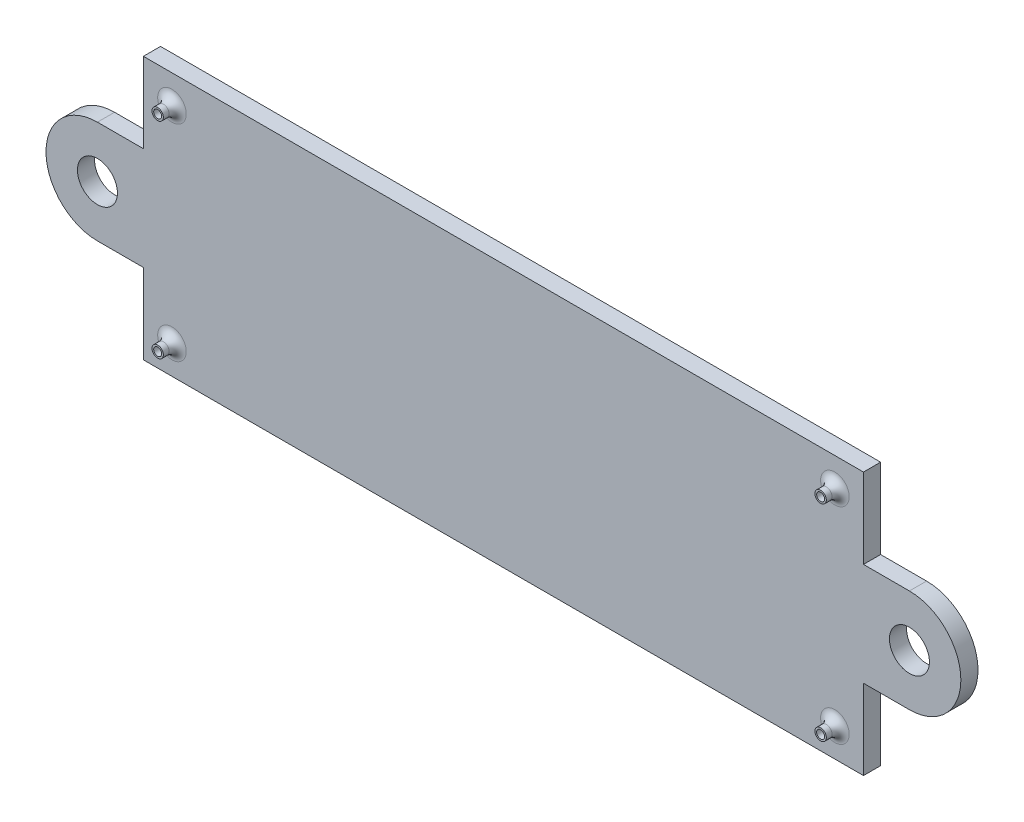
ISO-10303-21;
HEADER;
FILE_DESCRIPTION(('STEP AP214'),'2;1');
FILE_NAME('part.step','',(''),(''),'','','');
FILE_SCHEMA(('AUTOMOTIVE_DESIGN { 1 0 10303 214 1 1 1 1 }'));
ENDSEC;
DATA;
#1=APPLICATION_CONTEXT('core data for automotive mechanical design processes');
#2=APPLICATION_PROTOCOL_DEFINITION('international standard','automotive_design',2000,#1);
#3=PRODUCT_CONTEXT('',#1,'mechanical');
#4=PRODUCT('Part','Part','',(#3));
#5=PRODUCT_RELATED_PRODUCT_CATEGORY('part','',(#4));
#6=PRODUCT_DEFINITION_FORMATION('','',#4);
#7=PRODUCT_DEFINITION_CONTEXT('part definition',#1,'design');
#8=PRODUCT_DEFINITION('design','',#6,#7);
#9=PRODUCT_DEFINITION_SHAPE('','',#8);
#10=(LENGTH_UNIT() NAMED_UNIT(*) SI_UNIT(.MILLI.,.METRE.));
#11=(NAMED_UNIT(*) PLANE_ANGLE_UNIT() SI_UNIT($,.RADIAN.));
#12=(NAMED_UNIT(*) SI_UNIT($,.STERADIAN.) SOLID_ANGLE_UNIT());
#13=UNCERTAINTY_MEASURE_WITH_UNIT(LENGTH_MEASURE(1.E-05),#10,'distance_accuracy_value','');
#14=(GEOMETRIC_REPRESENTATION_CONTEXT(3) GLOBAL_UNCERTAINTY_ASSIGNED_CONTEXT((#13)) GLOBAL_UNIT_ASSIGNED_CONTEXT((#10,
#11,#12)) REPRESENTATION_CONTEXT('',''));
#15=CARTESIAN_POINT('',(0.,0.,0.));
#16=DIRECTION('',(0.,0.,1.));
#17=DIRECTION('',(1.,0.,0.));
#18=AXIS2_PLACEMENT_3D('',#15,#16,#17);
#19=CARTESIAN_POINT('',(-1.5,-1.50000000000002,-134.134261096858));
#20=DIRECTION('',(-1.,0.,0.));
#21=DIRECTION('',(0.,-1.,0.));
#22=AXIS2_PLACEMENT_3D('',#19,#20,#21);
#23=PLANE('',#22);
#24=DIRECTION('',(0.,-1.,0.));
#25=VECTOR('',#24,1.);
#26=CARTESIAN_POINT('',(-1.5,-1.50000000000002,3.));
#27=LINE('',#26,#25);
#28=CARTESIAN_POINT('',(-1.5,12.5,3.));
#29=VERTEX_POINT('',#28);
#30=CARTESIAN_POINT('',(-1.5,-1.50000000000002,3.));
#31=VERTEX_POINT('',#30);
#32=EDGE_CURVE('E226',#29,#31,#27,.T.);
#33=ORIENTED_EDGE('',*,*,#32,.F.);
#34=DIRECTION('',(0.,0.,-1.));
#35=VECTOR('',#34,1.);
#36=CARTESIAN_POINT('',(-1.5,12.5,27.7863367636564));
#37=LINE('',#36,#35);
#38=CARTESIAN_POINT('',(-1.5,12.5,0.));
#39=VERTEX_POINT('',#38);
#40=EDGE_CURVE('E139',#29,#39,#37,.T.);
#41=ORIENTED_EDGE('',*,*,#40,.T.);
#42=DIRECTION('',(0.,-1.,0.));
#43=VECTOR('',#42,1.);
#44=CARTESIAN_POINT('',(-1.5,-1.50000000000002,0.));
#45=LINE('',#44,#43);
#46=CARTESIAN_POINT('',(-1.5,-1.50000000000002,0.));
#47=VERTEX_POINT('',#46);
#48=EDGE_CURVE('E245',#39,#47,#45,.T.);
#49=ORIENTED_EDGE('',*,*,#48,.T.);
#50=DIRECTION('',(0.,0.,1.));
#51=VECTOR('',#50,1.);
#52=CARTESIAN_POINT('',(-1.5,-1.50000000000002,-134.134261096858));
#53=LINE('',#52,#51);
#54=EDGE_CURVE('E244',#47,#31,#53,.T.);
#55=ORIENTED_EDGE('',*,*,#54,.T.);
#56=EDGE_LOOP('',(#33,#41,#49,#55));
#57=FACE_BOUND('',#56,.T.);
#58=ADVANCED_FACE('F36',(#57),#23,.T.);
#59=CARTESIAN_POINT('',(124.5,44.5,-134.134261096858));
#60=DIRECTION('',(1.,0.,0.));
#61=DIRECTION('',(0.,1.,0.));
#62=AXIS2_PLACEMENT_3D('',#59,#60,#61);
#63=PLANE('',#62);
#64=DIRECTION('',(0.,1.,0.));
#65=VECTOR('',#64,1.);
#66=CARTESIAN_POINT('',(124.5,44.5,3.));
#67=LINE('',#66,#65);
#68=CARTESIAN_POINT('',(124.5,30.5,3.));
#69=VERTEX_POINT('',#68);
#70=CARTESIAN_POINT('',(124.5,44.5,3.));
#71=VERTEX_POINT('',#70);
#72=EDGE_CURVE('E59',#69,#71,#67,.T.);
#73=ORIENTED_EDGE('',*,*,#72,.F.);
#74=DIRECTION('',(0.,0.,-1.));
#75=VECTOR('',#74,1.);
#76=CARTESIAN_POINT('',(124.5,30.5,27.7863367636564));
#77=LINE('',#76,#75);
#78=CARTESIAN_POINT('',(124.5,30.5,0.));
#79=VERTEX_POINT('',#78);
#80=EDGE_CURVE('E183',#69,#79,#77,.T.);
#81=ORIENTED_EDGE('',*,*,#80,.T.);
#82=DIRECTION('',(0.,1.,0.));
#83=VECTOR('',#82,1.);
#84=CARTESIAN_POINT('',(124.5,44.5,0.));
#85=LINE('',#84,#83);
#86=CARTESIAN_POINT('',(124.5,44.5,0.));
#87=VERTEX_POINT('',#86);
#88=EDGE_CURVE('E237',#79,#87,#85,.T.);
#89=ORIENTED_EDGE('',*,*,#88,.T.);
#90=DIRECTION('',(0.,0.,1.));
#91=VECTOR('',#90,1.);
#92=CARTESIAN_POINT('',(124.5,44.5,-134.134261096858));
#93=LINE('',#92,#91);
#94=EDGE_CURVE('E234',#87,#71,#93,.T.);
#95=ORIENTED_EDGE('',*,*,#94,.T.);
#96=EDGE_LOOP('',(#73,#81,#89,#95));
#97=FACE_BOUND('',#96,.T.);
#98=ADVANCED_FACE('F300',(#97),#63,.T.);
#99=CARTESIAN_POINT('',(0.,0.,3.));
#100=DIRECTION('',(0.,0.,-1.));
#101=DIRECTION('',(-1.,0.,0.));
#102=AXIS2_PLACEMENT_3D('',#99,#100,#101);
#103=PLANE('',#102);
#104=CARTESIAN_POINT('',(119.5,3.5,3.));
#105=DIRECTION('',(0.,0.,-1.));
#106=DIRECTION('',(-1.,0.,0.));
#107=AXIS2_PLACEMENT_3D('',#104,#105,#106);
#108=CIRCLE('',#107,2.5);
#109=CARTESIAN_POINT('',(117.,3.5,3.));
#110=VERTEX_POINT('',#109);
#111=EDGE_CURVE('E11',#110,#110,#108,.T.);
#112=ORIENTED_EDGE('',*,*,#111,.T.);
#113=EDGE_LOOP('',(#112));
#114=FACE_BOUND('',#113,.T.);
#115=CARTESIAN_POINT('',(3.49999999999999,3.49999999999998,3.));
#116=DIRECTION('',(0.,0.,-1.));
#117=DIRECTION('',(-1.,0.,0.));
#118=AXIS2_PLACEMENT_3D('',#115,#116,#117);
#119=CIRCLE('',#118,2.5);
#120=CARTESIAN_POINT('',(0.999999999999993,3.49999999999998,3.));
#121=VERTEX_POINT('',#120);
#122=EDGE_CURVE('E272',#121,#121,#119,.T.);
#123=ORIENTED_EDGE('',*,*,#122,.T.);
#124=EDGE_LOOP('',(#123));
#125=FACE_BOUND('',#124,.T.);
#126=CARTESIAN_POINT('',(119.5,39.5,3.));
#127=DIRECTION('',(0.,0.,-1.));
#128=DIRECTION('',(-1.,0.,0.));
#129=AXIS2_PLACEMENT_3D('',#126,#127,#128);
#130=CIRCLE('',#129,2.5);
#131=CARTESIAN_POINT('',(117.,39.5,3.));
#132=VERTEX_POINT('',#131);
#133=EDGE_CURVE('E263',#132,#132,#130,.T.);
#134=ORIENTED_EDGE('',*,*,#133,.T.);
#135=EDGE_LOOP('',(#134));
#136=FACE_BOUND('',#135,.T.);
#137=CARTESIAN_POINT('',(3.49999999999999,39.5,3.));
#138=DIRECTION('',(0.,0.,-1.));
#139=DIRECTION('',(-1.,0.,0.));
#140=AXIS2_PLACEMENT_3D('',#137,#138,#139);
#141=CIRCLE('',#140,2.5);
#142=CARTESIAN_POINT('',(0.999999999999989,39.5,3.));
#143=VERTEX_POINT('',#142);
#144=EDGE_CURVE('E257',#143,#143,#141,.T.);
#145=ORIENTED_EDGE('',*,*,#144,.T.);
#146=EDGE_LOOP('',(#145));
#147=FACE_BOUND('',#146,.T.);
#148=DIRECTION('',(1.,0.,0.));
#149=VECTOR('',#148,1.);
#150=CARTESIAN_POINT('',(124.5,-1.5,3.));
#151=LINE('',#150,#149);
#152=CARTESIAN_POINT('',(124.5,-1.5,3.));
#153=VERTEX_POINT('',#152);
#154=EDGE_CURVE('E232',#31,#153,#151,.T.);
#155=ORIENTED_EDGE('',*,*,#154,.T.);
#156=CARTESIAN_POINT('',(124.5,12.5,3.));
#157=VERTEX_POINT('',#156);
#158=EDGE_CURVE('E229',#153,#157,#67,.T.);
#159=ORIENTED_EDGE('',*,*,#158,.T.);
#160=DIRECTION('',(1.,0.,0.));
#161=VECTOR('',#160,1.);
#162=CARTESIAN_POINT('',(124.5,12.5,3.));
#163=LINE('',#162,#161);
#164=CARTESIAN_POINT('',(132.540026119739,12.5,3.));
#165=VERTEX_POINT('',#164);
#166=EDGE_CURVE('E167',#157,#165,#163,.T.);
#167=ORIENTED_EDGE('',*,*,#166,.T.);
#168=CARTESIAN_POINT('',(132.540026119739,21.5,3.));
#169=DIRECTION('',(0.,0.,-1.));
#170=DIRECTION('',(-1.,0.,0.));
#171=AXIS2_PLACEMENT_3D('',#168,#169,#170);
#172=CIRCLE('',#171,9.);
#173=CARTESIAN_POINT('',(132.540026119739,30.5,3.));
#174=VERTEX_POINT('',#173);
#175=EDGE_CURVE('E168',#165,#174,#172,.F.);
#176=ORIENTED_EDGE('',*,*,#175,.T.);
#177=DIRECTION('',(-1.,0.,0.));
#178=VECTOR('',#177,1.);
#179=CARTESIAN_POINT('',(124.5,30.5,3.));
#180=LINE('',#179,#178);
#181=EDGE_CURVE('E164',#174,#69,#180,.T.);
#182=ORIENTED_EDGE('',*,*,#181,.T.);
#183=ORIENTED_EDGE('',*,*,#72,.T.);
#184=DIRECTION('',(-1.,0.,0.));
#185=VECTOR('',#184,1.);
#186=CARTESIAN_POINT('',(-1.50000000000001,44.5,3.));
#187=LINE('',#186,#185);
#188=CARTESIAN_POINT('',(-1.50000000000001,44.5,3.));
#189=VERTEX_POINT('',#188);
#190=EDGE_CURVE('E227',#71,#189,#187,.T.);
#191=ORIENTED_EDGE('',*,*,#190,.T.);
#192=CARTESIAN_POINT('',(-1.5,30.5,3.));
#193=VERTEX_POINT('',#192);
#194=EDGE_CURVE('E135',#189,#193,#27,.T.);
#195=ORIENTED_EDGE('',*,*,#194,.T.);
#196=DIRECTION('',(1.,0.,0.));
#197=VECTOR('',#196,1.);
#198=CARTESIAN_POINT('',(-1.5,30.5,3.));
#199=LINE('',#198,#197);
#200=CARTESIAN_POINT('',(-9.54002611973892,30.5,3.));
#201=VERTEX_POINT('',#200);
#202=EDGE_CURVE('E125',#201,#193,#199,.T.);
#203=ORIENTED_EDGE('',*,*,#202,.F.);
#204=CARTESIAN_POINT('',(-9.54002611973892,21.5,3.));
#205=DIRECTION('',(0.,0.,-1.));
#206=DIRECTION('',(-1.,0.,0.));
#207=AXIS2_PLACEMENT_3D('',#204,#205,#206);
#208=CIRCLE('',#207,9.);
#209=CARTESIAN_POINT('',(-9.54002611973892,12.5,3.));
#210=VERTEX_POINT('',#209);
#211=EDGE_CURVE('E131',#210,#201,#208,.T.);
#212=ORIENTED_EDGE('',*,*,#211,.F.);
#213=DIRECTION('',(-1.,0.,0.));
#214=VECTOR('',#213,1.);
#215=CARTESIAN_POINT('',(-1.5,12.5,3.));
#216=LINE('',#215,#214);
#217=EDGE_CURVE('E158',#29,#210,#216,.T.);
#218=ORIENTED_EDGE('',*,*,#217,.F.);
#219=ORIENTED_EDGE('',*,*,#32,.T.);
#220=EDGE_LOOP('',(#155,#159,#167,#176,#182,#183,#191,#195,#203,#212,#218,#219));
#221=FACE_BOUND('',#220,.T.);
#222=CARTESIAN_POINT('',(132.540026119739,21.5,3.));
#223=DIRECTION('',(0.,0.,-1.));
#224=DIRECTION('',(-1.,0.,0.));
#225=AXIS2_PLACEMENT_3D('',#222,#223,#224);
#226=CIRCLE('',#225,3.49999999999999);
#227=CARTESIAN_POINT('',(129.040026119739,21.5,3.));
#228=VERTEX_POINT('',#227);
#229=EDGE_CURVE('E166',#228,#228,#226,.F.);
#230=ORIENTED_EDGE('',*,*,#229,.F.);
#231=EDGE_LOOP('',(#230));
#232=FACE_BOUND('',#231,.T.);
#233=CARTESIAN_POINT('',(-9.54002611973892,21.5,3.));
#234=DIRECTION('',(0.,0.,-1.));
#235=DIRECTION('',(-1.,0.,0.));
#236=AXIS2_PLACEMENT_3D('',#233,#234,#235);
#237=CIRCLE('',#236,3.49999999999999);
#238=CARTESIAN_POINT('',(-13.0400261197389,21.5,3.));
#239=VERTEX_POINT('',#238);
#240=EDGE_CURVE('E160',#239,#239,#237,.T.);
#241=ORIENTED_EDGE('',*,*,#240,.T.);
#242=EDGE_LOOP('',(#241));
#243=FACE_BOUND('',#242,.T.);
#244=ADVANCED_FACE('F128',(#114,#125,#136,#147,#221,#232,#243),#103,.F.);
#245=CARTESIAN_POINT('',(124.5,-1.5,-134.134261096858));
#246=DIRECTION('',(0.,-1.,0.));
#247=DIRECTION('',(1.,0.,0.));
#248=AXIS2_PLACEMENT_3D('',#245,#246,#247);
#249=PLANE('',#248);
#250=ORIENTED_EDGE('',*,*,#54,.F.);
#251=DIRECTION('',(1.,0.,0.));
#252=VECTOR('',#251,1.);
#253=CARTESIAN_POINT('',(124.5,-1.5,0.));
#254=LINE('',#253,#252);
#255=CARTESIAN_POINT('',(124.5,-1.49999999999999,0.));
#256=VERTEX_POINT('',#255);
#257=EDGE_CURVE('E223',#47,#256,#254,.T.);
#258=ORIENTED_EDGE('',*,*,#257,.T.);
#259=DIRECTION('',(0.,0.,1.));
#260=VECTOR('',#259,1.);
#261=CARTESIAN_POINT('',(124.5,-1.5,-134.134261096858));
#262=LINE('',#261,#260);
#263=EDGE_CURVE('E240',#256,#153,#262,.T.);
#264=ORIENTED_EDGE('',*,*,#263,.T.);
#265=ORIENTED_EDGE('',*,*,#154,.F.);
#266=EDGE_LOOP('',(#250,#258,#264,#265));
#267=FACE_BOUND('',#266,.T.);
#268=ADVANCED_FACE('F314',(#267),#249,.T.);
#269=DIRECTION('',(0.,0.,-1.));
#270=VECTOR('',#269,1.);
#271=CARTESIAN_POINT('',(-1.5,30.5,27.7863367636564));
#272=LINE('',#271,#270);
#273=CARTESIAN_POINT('',(-1.5,30.5,0.));
#274=VERTEX_POINT('',#273);
#275=EDGE_CURVE('E138',#193,#274,#272,.T.);
#276=ORIENTED_EDGE('',*,*,#275,.F.);
#277=ORIENTED_EDGE('',*,*,#194,.F.);
#278=DIRECTION('',(0.,0.,1.));
#279=VECTOR('',#278,1.);
#280=CARTESIAN_POINT('',(-1.50000000000001,44.5,-134.134261096858));
#281=LINE('',#280,#279);
#282=CARTESIAN_POINT('',(-1.50000000000001,44.5,0.));
#283=VERTEX_POINT('',#282);
#284=EDGE_CURVE('E249',#283,#189,#281,.T.);
#285=ORIENTED_EDGE('',*,*,#284,.F.);
#286=EDGE_CURVE('E241',#283,#274,#45,.T.);
#287=ORIENTED_EDGE('',*,*,#286,.T.);
#288=EDGE_LOOP('',(#276,#277,#285,#287));
#289=FACE_BOUND('',#288,.T.);
#290=ADVANCED_FACE('F303',(#289),#23,.T.);
#291=CARTESIAN_POINT('',(-1.50000000000001,44.5,-134.134261096858));
#292=DIRECTION('',(0.,1.,0.));
#293=DIRECTION('',(0.,0.,1.));
#294=AXIS2_PLACEMENT_3D('',#291,#292,#293);
#295=PLANE('',#294);
#296=ORIENTED_EDGE('',*,*,#94,.F.);
#297=DIRECTION('',(-1.,0.,0.));
#298=VECTOR('',#297,1.);
#299=CARTESIAN_POINT('',(-1.50000000000001,44.5,0.));
#300=LINE('',#299,#298);
#301=EDGE_CURVE('E246',#87,#283,#300,.T.);
#302=ORIENTED_EDGE('',*,*,#301,.T.);
#303=ORIENTED_EDGE('',*,*,#284,.T.);
#304=ORIENTED_EDGE('',*,*,#190,.F.);
#305=EDGE_LOOP('',(#296,#302,#303,#304));
#306=FACE_BOUND('',#305,.T.);
#307=ADVANCED_FACE('F313',(#306),#295,.T.);
#308=DIRECTION('',(0.,0.,-1.));
#309=VECTOR('',#308,1.);
#310=CARTESIAN_POINT('',(124.5,12.5,27.7863367636564));
#311=LINE('',#310,#309);
#312=CARTESIAN_POINT('',(124.5,12.5,0.));
#313=VERTEX_POINT('',#312);
#314=EDGE_CURVE('E170',#157,#313,#311,.T.);
#315=ORIENTED_EDGE('',*,*,#314,.F.);
#316=ORIENTED_EDGE('',*,*,#158,.F.);
#317=ORIENTED_EDGE('',*,*,#263,.F.);
#318=EDGE_CURVE('E235',#256,#313,#85,.T.);
#319=ORIENTED_EDGE('',*,*,#318,.T.);
#320=EDGE_LOOP('',(#315,#316,#317,#319));
#321=FACE_BOUND('',#320,.T.);
#322=ADVANCED_FACE('F308',(#321),#63,.T.);
#323=CARTESIAN_POINT('',(0.,0.,0.));
#324=DIRECTION('',(0.,0.,-1.));
#325=DIRECTION('',(-1.,0.,0.));
#326=AXIS2_PLACEMENT_3D('',#323,#324,#325);
#327=PLANE('',#326);
#328=ORIENTED_EDGE('',*,*,#257,.F.);
#329=ORIENTED_EDGE('',*,*,#48,.F.);
#330=DIRECTION('',(1.,0.,0.));
#331=VECTOR('',#330,1.);
#332=CARTESIAN_POINT('',(-1.5,12.5,0.));
#333=LINE('',#332,#331);
#334=CARTESIAN_POINT('',(-9.54002611973892,12.5,0.));
#335=VERTEX_POINT('',#334);
#336=EDGE_CURVE('E51',#335,#39,#333,.T.);
#337=ORIENTED_EDGE('',*,*,#336,.F.);
#338=CARTESIAN_POINT('',(-9.54002611973892,21.5,0.));
#339=DIRECTION('',(0.,0.,1.));
#340=DIRECTION('',(-1.,0.,0.));
#341=AXIS2_PLACEMENT_3D('',#338,#339,#340);
#342=CIRCLE('',#341,9.);
#343=CARTESIAN_POINT('',(-9.54002611973892,30.5,0.));
#344=VERTEX_POINT('',#343);
#345=EDGE_CURVE('E149',#344,#335,#342,.T.);
#346=ORIENTED_EDGE('',*,*,#345,.F.);
#347=DIRECTION('',(-1.,0.,0.));
#348=VECTOR('',#347,1.);
#349=CARTESIAN_POINT('',(-1.5,30.5,0.));
#350=LINE('',#349,#348);
#351=EDGE_CURVE('E145',#274,#344,#350,.T.);
#352=ORIENTED_EDGE('',*,*,#351,.F.);
#353=ORIENTED_EDGE('',*,*,#286,.F.);
#354=ORIENTED_EDGE('',*,*,#301,.F.);
#355=ORIENTED_EDGE('',*,*,#88,.F.);
#356=DIRECTION('',(1.,0.,0.));
#357=VECTOR('',#356,1.);
#358=CARTESIAN_POINT('',(124.5,30.5,0.));
#359=LINE('',#358,#357);
#360=CARTESIAN_POINT('',(132.540026119739,30.5,0.));
#361=VERTEX_POINT('',#360);
#362=EDGE_CURVE('E174',#79,#361,#359,.T.);
#363=ORIENTED_EDGE('',*,*,#362,.T.);
#364=CARTESIAN_POINT('',(132.540026119739,21.5,0.));
#365=DIRECTION('',(0.,0.,-1.));
#366=DIRECTION('',(1.,0.,0.));
#367=AXIS2_PLACEMENT_3D('',#364,#365,#366);
#368=CIRCLE('',#367,9.);
#369=CARTESIAN_POINT('',(132.540026119739,12.5,0.));
#370=VERTEX_POINT('',#369);
#371=EDGE_CURVE('E177',#361,#370,#368,.T.);
#372=ORIENTED_EDGE('',*,*,#371,.T.);
#373=DIRECTION('',(-1.,0.,0.));
#374=VECTOR('',#373,1.);
#375=CARTESIAN_POINT('',(124.5,12.5,0.));
#376=LINE('',#375,#374);
#377=EDGE_CURVE('E180',#370,#313,#376,.T.);
#378=ORIENTED_EDGE('',*,*,#377,.T.);
#379=ORIENTED_EDGE('',*,*,#318,.F.);
#380=EDGE_LOOP('',(#328,#329,#337,#346,#352,#353,#354,#355,#363,#372,#378,#379));
#381=FACE_BOUND('',#380,.T.);
#382=CARTESIAN_POINT('',(132.540026119739,21.5,0.));
#383=DIRECTION('',(0.,0.,-1.));
#384=DIRECTION('',(-1.,0.,0.));
#385=AXIS2_PLACEMENT_3D('',#382,#383,#384);
#386=CIRCLE('',#385,3.49999999999999);
#387=CARTESIAN_POINT('',(129.040026119739,21.5,0.));
#388=VERTEX_POINT('',#387);
#389=EDGE_CURVE('E163',#388,#388,#386,.T.);
#390=ORIENTED_EDGE('',*,*,#389,.F.);
#391=EDGE_LOOP('',(#390));
#392=FACE_BOUND('',#391,.T.);
#393=CARTESIAN_POINT('',(-9.54002611973892,21.5,0.));
#394=DIRECTION('',(0.,0.,1.));
#395=DIRECTION('',(1.,0.,0.));
#396=AXIS2_PLACEMENT_3D('',#393,#394,#395);
#397=CIRCLE('',#396,3.49999999999999);
#398=CARTESIAN_POINT('',(-6.04002611973893,21.5,0.));
#399=VERTEX_POINT('',#398);
#400=EDGE_CURVE('E325',#399,#399,#397,.T.);
#401=ORIENTED_EDGE('',*,*,#400,.T.);
#402=EDGE_LOOP('',(#401));
#403=FACE_BOUND('',#402,.T.);
#404=ADVANCED_FACE('F332',(#381,#392,#403),#327,.T.);
#405=CARTESIAN_POINT('',(3.49999999999999,39.5,5.5));
#406=DIRECTION('',(0.,0.,1.));
#407=DIRECTION('',(1.,0.,0.));
#408=AXIS2_PLACEMENT_3D('',#405,#406,#407);
#409=PLANE('',#408);
#410=CARTESIAN_POINT('',(3.49999999999999,39.5,5.5));
#411=DIRECTION('',(0.,0.,1.));
#412=DIRECTION('',(1.,0.,0.));
#413=AXIS2_PLACEMENT_3D('',#410,#411,#412);
#414=CIRCLE('',#413,1.);
#415=CARTESIAN_POINT('',(4.49999999999999,39.5,5.5));
#416=VERTEX_POINT('',#415);
#417=EDGE_CURVE('E218',#416,#416,#414,.T.);
#418=ORIENTED_EDGE('',*,*,#417,.T.);
#419=EDGE_LOOP('',(#418));
#420=FACE_BOUND('',#419,.T.);
#421=CARTESIAN_POINT('',(3.49999999999999,39.5,5.5));
#422=DIRECTION('',(0.,0.,1.));
#423=DIRECTION('',(1.,0.,0.));
#424=AXIS2_PLACEMENT_3D('',#421,#422,#423);
#425=CIRCLE('',#424,0.69772156751062);
#426=CARTESIAN_POINT('',(4.19772156751061,39.5,5.5));
#427=VERTEX_POINT('',#426);
#428=EDGE_CURVE('E215',#427,#427,#425,.T.);
#429=ORIENTED_EDGE('',*,*,#428,.F.);
#430=EDGE_LOOP('',(#429));
#431=FACE_BOUND('',#430,.T.);
#432=ADVANCED_FACE('F401',(#420,#431),#409,.T.);
#433=CARTESIAN_POINT('',(3.49999999999999,39.5,5.5));
#434=DIRECTION('',(0.,0.,-1.));
#435=DIRECTION('',(-1.,0.,0.));
#436=AXIS2_PLACEMENT_3D('',#433,#434,#435);
#437=CYLINDRICAL_SURFACE('',#436,1.);
#438=CARTESIAN_POINT('',(3.49999999999999,39.5,4.5));
#439=DIRECTION('',(0.,0.,-1.));
#440=DIRECTION('',(-1.,0.,0.));
#441=AXIS2_PLACEMENT_3D('',#438,#439,#440);
#442=CIRCLE('',#441,1.);
#443=CARTESIAN_POINT('',(2.49999999999999,39.5,4.5));
#444=VERTEX_POINT('',#443);
#445=EDGE_CURVE('E225',#444,#444,#442,.F.);
#446=ORIENTED_EDGE('',*,*,#445,.T.);
#447=EDGE_LOOP('',(#446));
#448=FACE_BOUND('',#447,.T.);
#449=ORIENTED_EDGE('',*,*,#417,.F.);
#450=EDGE_LOOP('',(#449));
#451=FACE_BOUND('',#450,.T.);
#452=ADVANCED_FACE('F399',(#448,#451),#437,.T.);
#453=CARTESIAN_POINT('',(3.49999999999999,39.5,5.5));
#454=DIRECTION('',(0.,0.,-1.));
#455=DIRECTION('',(-1.,0.,0.));
#456=AXIS2_PLACEMENT_3D('',#453,#454,#455);
#457=CYLINDRICAL_SURFACE('',#456,0.69772156751062);
#458=ORIENTED_EDGE('',*,*,#428,.T.);
#459=EDGE_LOOP('',(#458));
#460=FACE_BOUND('',#459,.T.);
#461=CARTESIAN_POINT('',(3.49999999999999,39.5,3.));
#462=DIRECTION('',(0.,0.,1.));
#463=DIRECTION('',(1.,0.,0.));
#464=AXIS2_PLACEMENT_3D('',#461,#462,#463);
#465=CIRCLE('',#464,0.69772156751062);
#466=CARTESIAN_POINT('',(4.19772156751061,39.5,3.));
#467=VERTEX_POINT('',#466);
#468=EDGE_CURVE('E214',#467,#467,#465,.T.);
#469=ORIENTED_EDGE('',*,*,#468,.F.);
#470=EDGE_LOOP('',(#469));
#471=FACE_BOUND('',#470,.T.);
#472=ADVANCED_FACE('F395',(#460,#471),#457,.F.);
#473=ORIENTED_EDGE('',*,*,#468,.T.);
#474=EDGE_LOOP('',(#473));
#475=FACE_BOUND('',#474,.T.);
#476=ADVANCED_FACE('F398',(#475),#103,.F.);
#477=CARTESIAN_POINT('',(3.49999999999999,39.5,4.5));
#478=DIRECTION('',(0.,0.,-1.));
#479=DIRECTION('',(-1.,0.,0.));
#480=AXIS2_PLACEMENT_3D('',#477,#478,#479);
#481=TOROIDAL_SURFACE('',#480,2.5,1.5);
#482=ORIENTED_EDGE('',*,*,#144,.F.);
#483=EDGE_LOOP('',(#482));
#484=FACE_BOUND('',#483,.T.);
#485=ORIENTED_EDGE('',*,*,#445,.F.);
#486=EDGE_LOOP('',(#485));
#487=FACE_BOUND('',#486,.T.);
#488=ADVANCED_FACE('F393',(#484,#487),#481,.F.);
#489=CARTESIAN_POINT('',(119.5,39.5,5.5));
#490=DIRECTION('',(0.,0.,-1.));
#491=DIRECTION('',(-1.,0.,0.));
#492=AXIS2_PLACEMENT_3D('',#489,#490,#491);
#493=CYLINDRICAL_SURFACE('',#492,1.);
#494=CARTESIAN_POINT('',(119.5,39.5,4.5));
#495=DIRECTION('',(0.,0.,-1.));
#496=DIRECTION('',(-1.,0.,0.));
#497=AXIS2_PLACEMENT_3D('',#494,#495,#496);
#498=CIRCLE('',#497,1.);
#499=CARTESIAN_POINT('',(118.5,39.5,4.5));
#500=VERTEX_POINT('',#499);
#501=EDGE_CURVE('E266',#500,#500,#498,.F.);
#502=ORIENTED_EDGE('',*,*,#501,.T.);
#503=EDGE_LOOP('',(#502));
#504=FACE_BOUND('',#503,.T.);
#505=CARTESIAN_POINT('',(119.5,39.5,5.5));
#506=DIRECTION('',(0.,0.,-1.));
#507=DIRECTION('',(-1.,0.,0.));
#508=AXIS2_PLACEMENT_3D('',#505,#506,#507);
#509=CIRCLE('',#508,1.);
#510=CARTESIAN_POINT('',(118.5,39.5,5.5));
#511=VERTEX_POINT('',#510);
#512=EDGE_CURVE('E211',#511,#511,#509,.T.);
#513=ORIENTED_EDGE('',*,*,#512,.T.);
#514=EDGE_LOOP('',(#513));
#515=FACE_BOUND('',#514,.T.);
#516=ADVANCED_FACE('F389',(#504,#515),#493,.T.);
#517=CARTESIAN_POINT('',(119.5,39.5,5.5));
#518=DIRECTION('',(0.,0.,1.));
#519=DIRECTION('',(-1.,0.,0.));
#520=AXIS2_PLACEMENT_3D('',#517,#518,#519);
#521=PLANE('',#520);
#522=CARTESIAN_POINT('',(119.5,39.5,5.5));
#523=DIRECTION('',(0.,0.,-1.));
#524=DIRECTION('',(-1.,0.,0.));
#525=AXIS2_PLACEMENT_3D('',#522,#523,#524);
#526=CIRCLE('',#525,0.69772156751062);
#527=CARTESIAN_POINT('',(118.802278432489,39.5,5.5));
#528=VERTEX_POINT('',#527);
#529=EDGE_CURVE('E208',#528,#528,#526,.T.);
#530=ORIENTED_EDGE('',*,*,#529,.T.);
#531=EDGE_LOOP('',(#530));
#532=FACE_BOUND('',#531,.T.);
#533=ORIENTED_EDGE('',*,*,#512,.F.);
#534=EDGE_LOOP('',(#533));
#535=FACE_BOUND('',#534,.T.);
#536=ADVANCED_FACE('F385',(#532,#535),#521,.T.);
#537=CARTESIAN_POINT('',(119.5,39.5,5.5));
#538=DIRECTION('',(0.,0.,-1.));
#539=DIRECTION('',(-1.,0.,0.));
#540=AXIS2_PLACEMENT_3D('',#537,#538,#539);
#541=CYLINDRICAL_SURFACE('',#540,0.69772156751062);
#542=ORIENTED_EDGE('',*,*,#529,.F.);
#543=EDGE_LOOP('',(#542));
#544=FACE_BOUND('',#543,.T.);
#545=CARTESIAN_POINT('',(119.5,39.5,3.));
#546=DIRECTION('',(0.,0.,-1.));
#547=DIRECTION('',(-1.,0.,0.));
#548=AXIS2_PLACEMENT_3D('',#545,#546,#547);
#549=CIRCLE('',#548,0.69772156751062);
#550=CARTESIAN_POINT('',(118.802278432489,39.5,3.));
#551=VERTEX_POINT('',#550);
#552=EDGE_CURVE('E260',#551,#551,#549,.T.);
#553=ORIENTED_EDGE('',*,*,#552,.T.);
#554=EDGE_LOOP('',(#553));
#555=FACE_BOUND('',#554,.T.);
#556=ADVANCED_FACE('F381',(#544,#555),#541,.F.);
#557=ORIENTED_EDGE('',*,*,#552,.F.);
#558=EDGE_LOOP('',(#557));
#559=FACE_BOUND('',#558,.T.);
#560=ADVANCED_FACE('F384',(#559),#103,.F.);
#561=CARTESIAN_POINT('',(119.5,39.5,4.5));
#562=DIRECTION('',(0.,0.,-1.));
#563=DIRECTION('',(-1.,0.,0.));
#564=AXIS2_PLACEMENT_3D('',#561,#562,#563);
#565=TOROIDAL_SURFACE('',#564,2.5,1.5);
#566=ORIENTED_EDGE('',*,*,#501,.F.);
#567=EDGE_LOOP('',(#566));
#568=FACE_BOUND('',#567,.T.);
#569=ORIENTED_EDGE('',*,*,#133,.F.);
#570=EDGE_LOOP('',(#569));
#571=FACE_BOUND('',#570,.T.);
#572=ADVANCED_FACE('F379',(#568,#571),#565,.F.);
#573=CARTESIAN_POINT('',(3.49999999999999,3.49999999999998,5.5));
#574=DIRECTION('',(0.,0.,-1.));
#575=DIRECTION('',(-1.,0.,0.));
#576=AXIS2_PLACEMENT_3D('',#573,#574,#575);
#577=CYLINDRICAL_SURFACE('',#576,1.);
#578=CARTESIAN_POINT('',(3.49999999999999,3.49999999999998,4.5));
#579=DIRECTION('',(0.,0.,-1.));
#580=DIRECTION('',(-1.,0.,0.));
#581=AXIS2_PLACEMENT_3D('',#578,#579,#580);
#582=CIRCLE('',#581,1.);
#583=CARTESIAN_POINT('',(2.49999999999999,3.49999999999998,4.5));
#584=VERTEX_POINT('',#583);
#585=EDGE_CURVE('E275',#584,#584,#582,.F.);
#586=ORIENTED_EDGE('',*,*,#585,.T.);
#587=EDGE_LOOP('',(#586));
#588=FACE_BOUND('',#587,.T.);
#589=CARTESIAN_POINT('',(3.49999999999999,3.49999999999998,5.5));
#590=DIRECTION('',(0.,0.,-1.));
#591=DIRECTION('',(1.,0.,0.));
#592=AXIS2_PLACEMENT_3D('',#589,#590,#591);
#593=CIRCLE('',#592,1.);
#594=CARTESIAN_POINT('',(4.49999999999999,3.49999999999998,5.5));
#595=VERTEX_POINT('',#594);
#596=EDGE_CURVE('E205',#595,#595,#593,.T.);
#597=ORIENTED_EDGE('',*,*,#596,.T.);
#598=EDGE_LOOP('',(#597));
#599=FACE_BOUND('',#598,.T.);
#600=ADVANCED_FACE('F375',(#588,#599),#577,.T.);
#601=CARTESIAN_POINT('',(3.49999999999999,3.49999999999998,5.5));
#602=DIRECTION('',(0.,0.,1.));
#603=DIRECTION('',(1.,0.,0.));
#604=AXIS2_PLACEMENT_3D('',#601,#602,#603);
#605=PLANE('',#604);
#606=CARTESIAN_POINT('',(3.49999999999999,3.49999999999998,5.5));
#607=DIRECTION('',(0.,0.,-1.));
#608=DIRECTION('',(1.,0.,0.));
#609=AXIS2_PLACEMENT_3D('',#606,#607,#608);
#610=CIRCLE('',#609,0.69772156751062);
#611=CARTESIAN_POINT('',(4.19772156751061,3.49999999999998,5.5));
#612=VERTEX_POINT('',#611);
#613=EDGE_CURVE('E202',#612,#612,#610,.T.);
#614=ORIENTED_EDGE('',*,*,#613,.T.);
#615=EDGE_LOOP('',(#614));
#616=FACE_BOUND('',#615,.T.);
#617=ORIENTED_EDGE('',*,*,#596,.F.);
#618=EDGE_LOOP('',(#617));
#619=FACE_BOUND('',#618,.T.);
#620=ADVANCED_FACE('F371',(#616,#619),#605,.T.);
#621=CARTESIAN_POINT('',(3.49999999999999,3.49999999999998,5.5));
#622=DIRECTION('',(0.,0.,-1.));
#623=DIRECTION('',(-1.,0.,0.));
#624=AXIS2_PLACEMENT_3D('',#621,#622,#623);
#625=CYLINDRICAL_SURFACE('',#624,0.69772156751062);
#626=ORIENTED_EDGE('',*,*,#613,.F.);
#627=EDGE_LOOP('',(#626));
#628=FACE_BOUND('',#627,.T.);
#629=CARTESIAN_POINT('',(3.49999999999999,3.49999999999998,3.));
#630=DIRECTION('',(0.,0.,-1.));
#631=DIRECTION('',(-1.,0.,0.));
#632=AXIS2_PLACEMENT_3D('',#629,#630,#631);
#633=CIRCLE('',#632,0.69772156751062);
#634=CARTESIAN_POINT('',(2.80227843248937,3.49999999999998,3.));
#635=VERTEX_POINT('',#634);
#636=EDGE_CURVE('E269',#635,#635,#633,.T.);
#637=ORIENTED_EDGE('',*,*,#636,.T.);
#638=EDGE_LOOP('',(#637));
#639=FACE_BOUND('',#638,.T.);
#640=ADVANCED_FACE('F368',(#628,#639),#625,.F.);
#641=ORIENTED_EDGE('',*,*,#636,.F.);
#642=EDGE_LOOP('',(#641));
#643=FACE_BOUND('',#642,.T.);
#644=ADVANCED_FACE('F297',(#643),#103,.F.);
#645=CARTESIAN_POINT('',(3.49999999999999,3.49999999999998,4.5));
#646=DIRECTION('',(0.,0.,-1.));
#647=DIRECTION('',(-1.,0.,0.));
#648=AXIS2_PLACEMENT_3D('',#645,#646,#647);
#649=TOROIDAL_SURFACE('',#648,2.5,1.5);
#650=ORIENTED_EDGE('',*,*,#585,.F.);
#651=EDGE_LOOP('',(#650));
#652=FACE_BOUND('',#651,.T.);
#653=ORIENTED_EDGE('',*,*,#122,.F.);
#654=EDGE_LOOP('',(#653));
#655=FACE_BOUND('',#654,.T.);
#656=ADVANCED_FACE('F364',(#652,#655),#649,.F.);
#657=CARTESIAN_POINT('',(119.5,3.5,5.5));
#658=DIRECTION('',(0.,0.,1.));
#659=DIRECTION('',(-1.,0.,0.));
#660=AXIS2_PLACEMENT_3D('',#657,#658,#659);
#661=PLANE('',#660);
#662=CARTESIAN_POINT('',(119.5,3.5,5.5));
#663=DIRECTION('',(0.,0.,1.));
#664=DIRECTION('',(-1.,0.,0.));
#665=AXIS2_PLACEMENT_3D('',#662,#663,#664);
#666=CIRCLE('',#665,1.);
#667=CARTESIAN_POINT('',(118.5,3.5,5.5));
#668=VERTEX_POINT('',#667);
#669=EDGE_CURVE('E197',#668,#668,#666,.T.);
#670=ORIENTED_EDGE('',*,*,#669,.T.);
#671=EDGE_LOOP('',(#670));
#672=FACE_BOUND('',#671,.T.);
#673=CARTESIAN_POINT('',(119.5,3.5,5.5));
#674=DIRECTION('',(0.,0.,1.));
#675=DIRECTION('',(-1.,0.,0.));
#676=AXIS2_PLACEMENT_3D('',#673,#674,#675);
#677=CIRCLE('',#676,0.69772156751062);
#678=CARTESIAN_POINT('',(118.802278432489,3.5,5.5));
#679=VERTEX_POINT('',#678);
#680=EDGE_CURVE('E194',#679,#679,#677,.T.);
#681=ORIENTED_EDGE('',*,*,#680,.F.);
#682=EDGE_LOOP('',(#681));
#683=FACE_BOUND('',#682,.T.);
#684=ADVANCED_FACE('F361',(#672,#683),#661,.T.);
#685=CARTESIAN_POINT('',(119.5,3.5,5.5));
#686=DIRECTION('',(0.,0.,-1.));
#687=DIRECTION('',(-1.,0.,0.));
#688=AXIS2_PLACEMENT_3D('',#685,#686,#687);
#689=CYLINDRICAL_SURFACE('',#688,1.);
#690=CARTESIAN_POINT('',(119.5,3.5,4.5));
#691=DIRECTION('',(0.,0.,-1.));
#692=DIRECTION('',(-1.,0.,0.));
#693=AXIS2_PLACEMENT_3D('',#690,#691,#692);
#694=CIRCLE('',#693,1.);
#695=CARTESIAN_POINT('',(118.5,3.5,4.5));
#696=VERTEX_POINT('',#695);
#697=EDGE_CURVE('E44',#696,#696,#694,.F.);
#698=ORIENTED_EDGE('',*,*,#697,.T.);
#699=EDGE_LOOP('',(#698));
#700=FACE_BOUND('',#699,.T.);
#701=ORIENTED_EDGE('',*,*,#669,.F.);
#702=EDGE_LOOP('',(#701));
#703=FACE_BOUND('',#702,.T.);
#704=ADVANCED_FACE('F280',(#700,#703),#689,.T.);
#705=CARTESIAN_POINT('',(119.5,3.5,5.5));
#706=DIRECTION('',(0.,0.,-1.));
#707=DIRECTION('',(-1.,0.,0.));
#708=AXIS2_PLACEMENT_3D('',#705,#706,#707);
#709=CYLINDRICAL_SURFACE('',#708,0.69772156751062);
#710=ORIENTED_EDGE('',*,*,#680,.T.);
#711=EDGE_LOOP('',(#710));
#712=FACE_BOUND('',#711,.T.);
#713=CARTESIAN_POINT('',(119.5,3.5,3.));
#714=DIRECTION('',(0.,0.,1.));
#715=DIRECTION('',(-1.,0.,0.));
#716=AXIS2_PLACEMENT_3D('',#713,#714,#715);
#717=CIRCLE('',#716,0.69772156751062);
#718=CARTESIAN_POINT('',(118.802278432489,3.5,3.));
#719=VERTEX_POINT('',#718);
#720=EDGE_CURVE('E193',#719,#719,#717,.T.);
#721=ORIENTED_EDGE('',*,*,#720,.F.);
#722=EDGE_LOOP('',(#721));
#723=FACE_BOUND('',#722,.T.);
#724=ADVANCED_FACE('F294',(#712,#723),#709,.F.);
#725=ORIENTED_EDGE('',*,*,#720,.T.);
#726=EDGE_LOOP('',(#725));
#727=FACE_BOUND('',#726,.T.);
#728=ADVANCED_FACE('F285',(#727),#103,.F.);
#729=CARTESIAN_POINT('',(119.5,3.5,4.5));
#730=DIRECTION('',(0.,0.,-1.));
#731=DIRECTION('',(-1.,0.,0.));
#732=AXIS2_PLACEMENT_3D('',#729,#730,#731);
#733=TOROIDAL_SURFACE('',#732,2.5,1.5);
#734=ORIENTED_EDGE('',*,*,#111,.F.);
#735=EDGE_LOOP('',(#734));
#736=FACE_BOUND('',#735,.T.);
#737=ORIENTED_EDGE('',*,*,#697,.F.);
#738=EDGE_LOOP('',(#737));
#739=FACE_BOUND('',#738,.T.);
#740=ADVANCED_FACE('F38',(#736,#739),#733,.F.);
#741=CARTESIAN_POINT('',(124.5,30.5,27.7863367636564));
#742=DIRECTION('',(0.,1.,0.));
#743=DIRECTION('',(0.,0.,1.));
#744=AXIS2_PLACEMENT_3D('',#741,#742,#743);
#745=PLANE('',#744);
#746=ORIENTED_EDGE('',*,*,#181,.F.);
#747=DIRECTION('',(0.,0.,-1.));
#748=VECTOR('',#747,1.);
#749=CARTESIAN_POINT('',(132.540026119739,30.5,27.7863367636564));
#750=LINE('',#749,#748);
#751=EDGE_CURVE('E188',#174,#361,#750,.T.);
#752=ORIENTED_EDGE('',*,*,#751,.T.);
#753=ORIENTED_EDGE('',*,*,#362,.F.);
#754=ORIENTED_EDGE('',*,*,#80,.F.);
#755=EDGE_LOOP('',(#746,#752,#753,#754));
#756=FACE_BOUND('',#755,.T.);
#757=ADVANCED_FACE('F284',(#756),#745,.T.);
#758=CARTESIAN_POINT('',(132.540026119739,21.5,27.7863367636564));
#759=DIRECTION('',(0.,0.,-1.));
#760=DIRECTION('',(-1.,0.,0.));
#761=AXIS2_PLACEMENT_3D('',#758,#759,#760);
#762=CYLINDRICAL_SURFACE('',#761,9.);
#763=ORIENTED_EDGE('',*,*,#175,.F.);
#764=DIRECTION('',(0.,0.,-1.));
#765=VECTOR('',#764,1.);
#766=CARTESIAN_POINT('',(132.540026119739,12.5,27.7863367636564));
#767=LINE('',#766,#765);
#768=EDGE_CURVE('E186',#165,#370,#767,.T.);
#769=ORIENTED_EDGE('',*,*,#768,.T.);
#770=ORIENTED_EDGE('',*,*,#371,.F.);
#771=ORIENTED_EDGE('',*,*,#751,.F.);
#772=EDGE_LOOP('',(#763,#769,#770,#771));
#773=FACE_BOUND('',#772,.T.);
#774=ADVANCED_FACE('F291',(#773),#762,.T.);
#775=CARTESIAN_POINT('',(124.5,12.5,27.7863367636564));
#776=DIRECTION('',(0.,-1.,0.));
#777=DIRECTION('',(1.,0.,0.));
#778=AXIS2_PLACEMENT_3D('',#775,#776,#777);
#779=PLANE('',#778);
#780=ORIENTED_EDGE('',*,*,#166,.F.);
#781=ORIENTED_EDGE('',*,*,#314,.T.);
#782=ORIENTED_EDGE('',*,*,#377,.F.);
#783=ORIENTED_EDGE('',*,*,#768,.F.);
#784=EDGE_LOOP('',(#780,#781,#782,#783));
#785=FACE_BOUND('',#784,.T.);
#786=ADVANCED_FACE('F350',(#785),#779,.T.);
#787=CARTESIAN_POINT('',(132.540026119739,21.5,27.7863367636564));
#788=DIRECTION('',(0.,0.,-1.));
#789=DIRECTION('',(-1.,0.,0.));
#790=AXIS2_PLACEMENT_3D('',#787,#788,#789);
#791=CYLINDRICAL_SURFACE('',#790,3.49999999999999);
#792=ORIENTED_EDGE('',*,*,#229,.T.);
#793=EDGE_LOOP('',(#792));
#794=FACE_BOUND('',#793,.T.);
#795=ORIENTED_EDGE('',*,*,#389,.T.);
#796=EDGE_LOOP('',(#795));
#797=FACE_BOUND('',#796,.T.);
#798=ADVANCED_FACE('F347',(#794,#797),#791,.F.);
#799=CARTESIAN_POINT('',(-1.5,30.5,27.7863367636564));
#800=DIRECTION('',(0.,-1.,0.));
#801=DIRECTION('',(1.,0.,0.));
#802=AXIS2_PLACEMENT_3D('',#799,#800,#801);
#803=PLANE('',#802);
#804=DIRECTION('',(0.,0.,-1.));
#805=VECTOR('',#804,1.);
#806=CARTESIAN_POINT('',(-9.54002611973892,30.5,27.7863367636564));
#807=LINE('',#806,#805);
#808=EDGE_CURVE('E142',#201,#344,#807,.T.);
#809=ORIENTED_EDGE('',*,*,#808,.F.);
#810=ORIENTED_EDGE('',*,*,#202,.T.);
#811=ORIENTED_EDGE('',*,*,#275,.T.);
#812=ORIENTED_EDGE('',*,*,#351,.T.);
#813=EDGE_LOOP('',(#809,#810,#811,#812));
#814=FACE_BOUND('',#813,.T.);
#815=ADVANCED_FACE('F143',(#814),#803,.F.);
#816=CARTESIAN_POINT('',(-9.54002611973892,21.5,27.7863367636564));
#817=DIRECTION('',(0.,0.,-1.));
#818=DIRECTION('',(-1.,0.,0.));
#819=AXIS2_PLACEMENT_3D('',#816,#817,#818);
#820=CYLINDRICAL_SURFACE('',#819,9.);
#821=DIRECTION('',(0.,0.,-1.));
#822=VECTOR('',#821,1.);
#823=CARTESIAN_POINT('',(-9.54002611973892,12.5,27.7863367636564));
#824=LINE('',#823,#822);
#825=EDGE_CURVE('E152',#210,#335,#824,.T.);
#826=ORIENTED_EDGE('',*,*,#825,.F.);
#827=ORIENTED_EDGE('',*,*,#211,.T.);
#828=ORIENTED_EDGE('',*,*,#808,.T.);
#829=ORIENTED_EDGE('',*,*,#345,.T.);
#830=EDGE_LOOP('',(#826,#827,#828,#829));
#831=FACE_BOUND('',#830,.T.);
#832=ADVANCED_FACE('F151',(#831),#820,.T.);
#833=CARTESIAN_POINT('',(-1.5,12.5,27.7863367636564));
#834=DIRECTION('',(0.,1.,0.));
#835=DIRECTION('',(-1.,0.,0.));
#836=AXIS2_PLACEMENT_3D('',#833,#834,#835);
#837=PLANE('',#836);
#838=ORIENTED_EDGE('',*,*,#40,.F.);
#839=ORIENTED_EDGE('',*,*,#217,.T.);
#840=ORIENTED_EDGE('',*,*,#825,.T.);
#841=ORIENTED_EDGE('',*,*,#336,.T.);
#842=EDGE_LOOP('',(#838,#839,#840,#841));
#843=FACE_BOUND('',#842,.T.);
#844=ADVANCED_FACE('F336',(#843),#837,.F.);
#845=CARTESIAN_POINT('',(-9.54002611973892,21.5,27.7863367636564));
#846=DIRECTION('',(0.,0.,-1.));
#847=DIRECTION('',(-1.,0.,0.));
#848=AXIS2_PLACEMENT_3D('',#845,#846,#847);
#849=CYLINDRICAL_SURFACE('',#848,3.49999999999999);
#850=ORIENTED_EDGE('',*,*,#240,.F.);
#851=EDGE_LOOP('',(#850));
#852=FACE_BOUND('',#851,.T.);
#853=ORIENTED_EDGE('',*,*,#400,.F.);
#854=EDGE_LOOP('',(#853));
#855=FACE_BOUND('',#854,.T.);
#856=ADVANCED_FACE('F334',(#852,#855),#849,.F.);
#857=CLOSED_SHELL('',(#58,#98,#244,#268,#290,#307,#322,#404,#432,#452,#472,#476,#488,#516,#536,
#556,#560,#572,#600,#620,#640,#644,#656,#684,#704,#724,#728,#740,#757,#774,#786,#798,#815,#832,
#844,#856));
#858=MANIFOLD_SOLID_BREP('B2',#857);
#859=ADVANCED_BREP_SHAPE_REPRESENTATION('',(#18,#858),#14);
#860=SHAPE_DEFINITION_REPRESENTATION(#9,#859);
ENDSEC;
END-ISO-10303-21;
